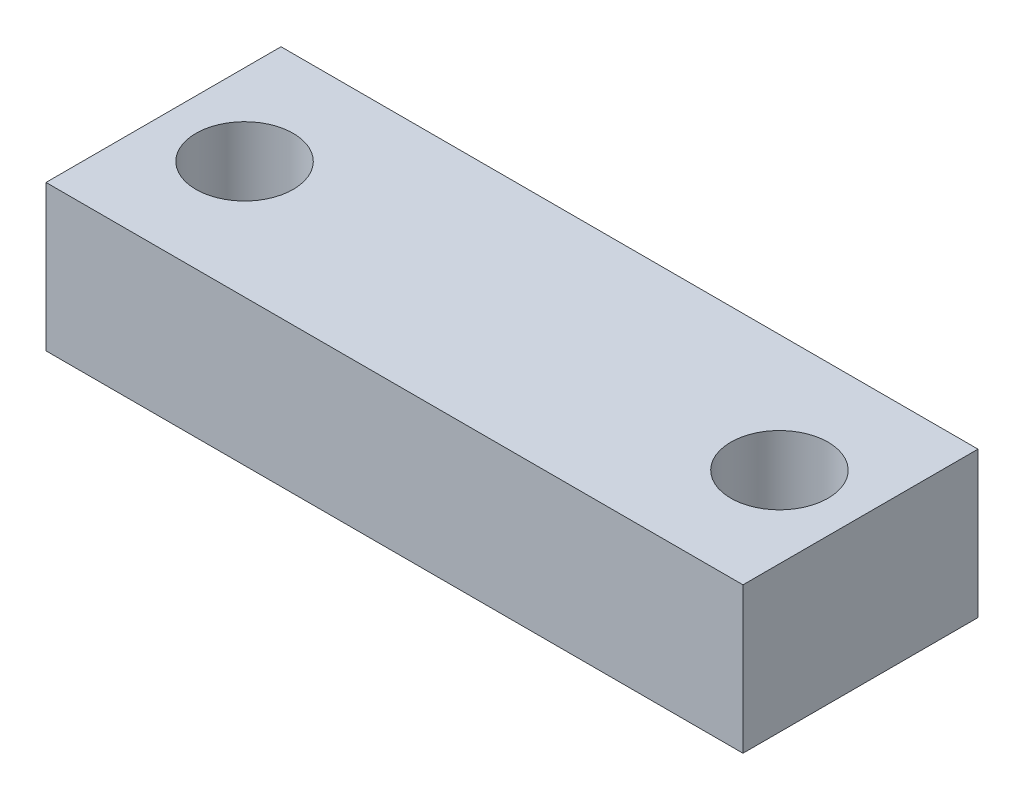
ISO-10303-21;
HEADER;
FILE_DESCRIPTION(('STEP AP214'),'2;1');
FILE_NAME('part.step','',(''),(''),'','','');
FILE_SCHEMA(('AUTOMOTIVE_DESIGN { 1 0 10303 214 1 1 1 1 }'));
ENDSEC;
DATA;
#1=APPLICATION_CONTEXT('core data for automotive mechanical design processes');
#2=APPLICATION_PROTOCOL_DEFINITION('international standard','automotive_design',2000,#1);
#3=PRODUCT_CONTEXT('',#1,'mechanical');
#4=PRODUCT('Part','Part','',(#3));
#5=PRODUCT_RELATED_PRODUCT_CATEGORY('part','',(#4));
#6=PRODUCT_DEFINITION_FORMATION('','',#4);
#7=PRODUCT_DEFINITION_CONTEXT('part definition',#1,'design');
#8=PRODUCT_DEFINITION('design','',#6,#7);
#9=PRODUCT_DEFINITION_SHAPE('','',#8);
#10=(LENGTH_UNIT() NAMED_UNIT(*) SI_UNIT(.MILLI.,.METRE.));
#11=(NAMED_UNIT(*) PLANE_ANGLE_UNIT() SI_UNIT($,.RADIAN.));
#12=(NAMED_UNIT(*) SI_UNIT($,.STERADIAN.) SOLID_ANGLE_UNIT());
#13=UNCERTAINTY_MEASURE_WITH_UNIT(LENGTH_MEASURE(1.E-05),#10,'distance_accuracy_value','');
#14=(GEOMETRIC_REPRESENTATION_CONTEXT(3) GLOBAL_UNCERTAINTY_ASSIGNED_CONTEXT((#13)) GLOBAL_UNIT_ASSIGNED_CONTEXT((#10,
#11,#12)) REPRESENTATION_CONTEXT('',''));
#15=CARTESIAN_POINT('',(0.,0.,0.));
#16=DIRECTION('',(0.,0.,1.));
#17=DIRECTION('',(1.,0.,0.));
#18=AXIS2_PLACEMENT_3D('',#15,#16,#17);
#19=CARTESIAN_POINT('',(21.5,9.,-7.25));
#20=DIRECTION('',(-1.,0.,0.));
#21=DIRECTION('',(0.,0.,1.));
#22=AXIS2_PLACEMENT_3D('',#19,#20,#21);
#23=PLANE('',#22);
#24=DIRECTION('',(0.,0.,-1.));
#25=VECTOR('',#24,1.);
#26=CARTESIAN_POINT('',(21.5,0.,-7.25));
#27=LINE('',#26,#25);
#28=CARTESIAN_POINT('',(21.5,0.,7.25));
#29=VERTEX_POINT('',#28);
#30=CARTESIAN_POINT('',(21.5,0.,-7.25));
#31=VERTEX_POINT('',#30);
#32=EDGE_CURVE('E107',#29,#31,#27,.T.);
#33=ORIENTED_EDGE('',*,*,#32,.T.);
#34=DIRECTION('',(0.,-1.,0.));
#35=VECTOR('',#34,1.);
#36=CARTESIAN_POINT('',(21.5,9.,-7.25));
#37=LINE('',#36,#35);
#38=CARTESIAN_POINT('',(21.5,9.,-7.25));
#39=VERTEX_POINT('',#38);
#40=EDGE_CURVE('E11',#39,#31,#37,.T.);
#41=ORIENTED_EDGE('',*,*,#40,.F.);
#42=DIRECTION('',(0.,0.,-1.));
#43=VECTOR('',#42,1.);
#44=CARTESIAN_POINT('',(21.5,9.,-7.25));
#45=LINE('',#44,#43);
#46=CARTESIAN_POINT('',(21.5,9.,7.25));
#47=VERTEX_POINT('',#46);
#48=EDGE_CURVE('E91',#47,#39,#45,.T.);
#49=ORIENTED_EDGE('',*,*,#48,.F.);
#50=DIRECTION('',(0.,-1.,0.));
#51=VECTOR('',#50,1.);
#52=CARTESIAN_POINT('',(21.5,9.,7.25));
#53=LINE('',#52,#51);
#54=EDGE_CURVE('E103',#47,#29,#53,.T.);
#55=ORIENTED_EDGE('',*,*,#54,.T.);
#56=EDGE_LOOP('',(#33,#41,#49,#55));
#57=FACE_BOUND('',#56,.T.);
#58=ADVANCED_FACE('F39',(#57),#23,.F.);
#59=CARTESIAN_POINT('',(-21.5,9.,-7.25));
#60=DIRECTION('',(0.,0.,1.));
#61=DIRECTION('',(1.,0.,0.));
#62=AXIS2_PLACEMENT_3D('',#59,#60,#61);
#63=PLANE('',#62);
#64=DIRECTION('',(-1.,0.,0.));
#65=VECTOR('',#64,1.);
#66=CARTESIAN_POINT('',(-21.5,0.,-7.25));
#67=LINE('',#66,#65);
#68=CARTESIAN_POINT('',(-21.5,0.,-7.25));
#69=VERTEX_POINT('',#68);
#70=EDGE_CURVE('E96',#31,#69,#67,.T.);
#71=ORIENTED_EDGE('',*,*,#70,.T.);
#72=DIRECTION('',(0.,-1.,0.));
#73=VECTOR('',#72,1.);
#74=CARTESIAN_POINT('',(-21.5,9.,-7.25));
#75=LINE('',#74,#73);
#76=CARTESIAN_POINT('',(-21.5,9.,-7.25));
#77=VERTEX_POINT('',#76);
#78=EDGE_CURVE('E48',#77,#69,#75,.T.);
#79=ORIENTED_EDGE('',*,*,#78,.F.);
#80=DIRECTION('',(-1.,0.,0.));
#81=VECTOR('',#80,1.);
#82=CARTESIAN_POINT('',(-21.5,9.,-7.25));
#83=LINE('',#82,#81);
#84=EDGE_CURVE('E86',#39,#77,#83,.T.);
#85=ORIENTED_EDGE('',*,*,#84,.F.);
#86=ORIENTED_EDGE('',*,*,#40,.T.);
#87=EDGE_LOOP('',(#71,#79,#85,#86));
#88=FACE_BOUND('',#87,.T.);
#89=ADVANCED_FACE('F95',(#88),#63,.F.);
#90=CARTESIAN_POINT('',(-21.5,9.,-7.25));
#91=DIRECTION('',(1.,0.,0.));
#92=DIRECTION('',(0.,0.,-1.));
#93=AXIS2_PLACEMENT_3D('',#90,#91,#92);
#94=PLANE('',#93);
#95=DIRECTION('',(0.,0.,1.));
#96=VECTOR('',#95,1.);
#97=CARTESIAN_POINT('',(-21.5,0.,-7.25));
#98=LINE('',#97,#96);
#99=CARTESIAN_POINT('',(-21.5,0.,7.25));
#100=VERTEX_POINT('',#99);
#101=EDGE_CURVE('E73',#69,#100,#98,.T.);
#102=ORIENTED_EDGE('',*,*,#101,.T.);
#103=DIRECTION('',(0.,-1.,0.));
#104=VECTOR('',#103,1.);
#105=CARTESIAN_POINT('',(-21.5,9.,7.25));
#106=LINE('',#105,#104);
#107=CARTESIAN_POINT('',(-21.5,9.,7.25));
#108=VERTEX_POINT('',#107);
#109=EDGE_CURVE('E98',#108,#100,#106,.T.);
#110=ORIENTED_EDGE('',*,*,#109,.F.);
#111=DIRECTION('',(0.,0.,1.));
#112=VECTOR('',#111,1.);
#113=CARTESIAN_POINT('',(-21.5,9.,-7.25));
#114=LINE('',#113,#112);
#115=EDGE_CURVE('E89',#77,#108,#114,.T.);
#116=ORIENTED_EDGE('',*,*,#115,.F.);
#117=ORIENTED_EDGE('',*,*,#78,.T.);
#118=EDGE_LOOP('',(#102,#110,#116,#117));
#119=FACE_BOUND('',#118,.T.);
#120=ADVANCED_FACE('F99',(#119),#94,.F.);
#121=CARTESIAN_POINT('',(-21.5,9.,7.25));
#122=DIRECTION('',(0.,0.,-1.));
#123=DIRECTION('',(-1.,0.,0.));
#124=AXIS2_PLACEMENT_3D('',#121,#122,#123);
#125=PLANE('',#124);
#126=DIRECTION('',(1.,0.,0.));
#127=VECTOR('',#126,1.);
#128=CARTESIAN_POINT('',(-21.5,0.,7.25));
#129=LINE('',#128,#127);
#130=EDGE_CURVE('E79',#100,#29,#129,.T.);
#131=ORIENTED_EDGE('',*,*,#130,.T.);
#132=ORIENTED_EDGE('',*,*,#54,.F.);
#133=DIRECTION('',(1.,0.,0.));
#134=VECTOR('',#133,1.);
#135=CARTESIAN_POINT('',(-21.5,9.,7.25));
#136=LINE('',#135,#134);
#137=EDGE_CURVE('E56',#108,#47,#136,.T.);
#138=ORIENTED_EDGE('',*,*,#137,.F.);
#139=ORIENTED_EDGE('',*,*,#109,.T.);
#140=EDGE_LOOP('',(#131,#132,#138,#139));
#141=FACE_BOUND('',#140,.T.);
#142=ADVANCED_FACE('F121',(#141),#125,.F.);
#143=CARTESIAN_POINT('',(0.,9.,0.));
#144=DIRECTION('',(0.,1.,0.));
#145=DIRECTION('',(0.,0.,1.));
#146=AXIS2_PLACEMENT_3D('',#143,#144,#145);
#147=PLANE('',#146);
#148=CARTESIAN_POINT('',(-16.5,9.,0.));
#149=DIRECTION('',(0.,1.,0.));
#150=DIRECTION('',(0.,0.,1.));
#151=AXIS2_PLACEMENT_3D('',#148,#149,#150);
#152=CIRCLE('',#151,3.);
#153=CARTESIAN_POINT('',(-16.5,9.,3.));
#154=VERTEX_POINT('',#153);
#155=EDGE_CURVE('E136',#154,#154,#152,.T.);
#156=ORIENTED_EDGE('',*,*,#155,.F.);
#157=EDGE_LOOP('',(#156));
#158=FACE_BOUND('',#157,.T.);
#159=CARTESIAN_POINT('',(16.5,9.,0.));
#160=DIRECTION('',(0.,1.,0.));
#161=DIRECTION('',(0.,0.,-1.));
#162=AXIS2_PLACEMENT_3D('',#159,#160,#161);
#163=CIRCLE('',#162,3.);
#164=CARTESIAN_POINT('',(16.5,9.,-3.));
#165=VERTEX_POINT('',#164);
#166=EDGE_CURVE('E128',#165,#165,#163,.T.);
#167=ORIENTED_EDGE('',*,*,#166,.F.);
#168=EDGE_LOOP('',(#167));
#169=FACE_BOUND('',#168,.T.);
#170=ORIENTED_EDGE('',*,*,#48,.T.);
#171=ORIENTED_EDGE('',*,*,#84,.T.);
#172=ORIENTED_EDGE('',*,*,#115,.T.);
#173=ORIENTED_EDGE('',*,*,#137,.T.);
#174=EDGE_LOOP('',(#170,#171,#172,#173));
#175=FACE_BOUND('',#174,.T.);
#176=ADVANCED_FACE('F87',(#158,#169,#175),#147,.T.);
#177=CARTESIAN_POINT('',(0.,0.,0.));
#178=DIRECTION('',(0.,1.,0.));
#179=DIRECTION('',(0.,0.,1.));
#180=AXIS2_PLACEMENT_3D('',#177,#178,#179);
#181=PLANE('',#180);
#182=CARTESIAN_POINT('',(-16.5,0.,0.));
#183=DIRECTION('',(0.,1.,0.));
#184=DIRECTION('',(0.,0.,1.));
#185=AXIS2_PLACEMENT_3D('',#182,#183,#184);
#186=CIRCLE('',#185,3.);
#187=CARTESIAN_POINT('',(-16.5,0.,3.));
#188=VERTEX_POINT('',#187);
#189=EDGE_CURVE('E111',#188,#188,#186,.T.);
#190=ORIENTED_EDGE('',*,*,#189,.T.);
#191=EDGE_LOOP('',(#190));
#192=FACE_BOUND('',#191,.T.);
#193=CARTESIAN_POINT('',(16.5,0.,0.));
#194=DIRECTION('',(0.,1.,0.));
#195=DIRECTION('',(0.,0.,-1.));
#196=AXIS2_PLACEMENT_3D('',#193,#194,#195);
#197=CIRCLE('',#196,3.);
#198=CARTESIAN_POINT('',(16.5,0.,-3.));
#199=VERTEX_POINT('',#198);
#200=EDGE_CURVE('E132',#199,#199,#197,.T.);
#201=ORIENTED_EDGE('',*,*,#200,.T.);
#202=EDGE_LOOP('',(#201));
#203=FACE_BOUND('',#202,.T.);
#204=ORIENTED_EDGE('',*,*,#32,.F.);
#205=ORIENTED_EDGE('',*,*,#130,.F.);
#206=ORIENTED_EDGE('',*,*,#101,.F.);
#207=ORIENTED_EDGE('',*,*,#70,.F.);
#208=EDGE_LOOP('',(#204,#205,#206,#207));
#209=FACE_BOUND('',#208,.T.);
#210=ADVANCED_FACE('F124',(#192,#203,#209),#181,.F.);
#211=CARTESIAN_POINT('',(16.5,0.,0.));
#212=DIRECTION('',(0.,1.,0.));
#213=DIRECTION('',(0.,0.,1.));
#214=AXIS2_PLACEMENT_3D('',#211,#212,#213);
#215=CYLINDRICAL_SURFACE('',#214,3.);
#216=ORIENTED_EDGE('',*,*,#200,.F.);
#217=EDGE_LOOP('',(#216));
#218=FACE_BOUND('',#217,.T.);
#219=ORIENTED_EDGE('',*,*,#166,.T.);
#220=EDGE_LOOP('',(#219));
#221=FACE_BOUND('',#220,.T.);
#222=ADVANCED_FACE('F149',(#218,#221),#215,.F.);
#223=CARTESIAN_POINT('',(-16.5,0.,0.));
#224=DIRECTION('',(0.,1.,0.));
#225=DIRECTION('',(0.,0.,1.));
#226=AXIS2_PLACEMENT_3D('',#223,#224,#225);
#227=CYLINDRICAL_SURFACE('',#226,3.);
#228=ORIENTED_EDGE('',*,*,#189,.F.);
#229=EDGE_LOOP('',(#228));
#230=FACE_BOUND('',#229,.T.);
#231=ORIENTED_EDGE('',*,*,#155,.T.);
#232=EDGE_LOOP('',(#231));
#233=FACE_BOUND('',#232,.T.);
#234=ADVANCED_FACE('F146',(#230,#233),#227,.F.);
#235=CLOSED_SHELL('',(#58,#89,#120,#142,#176,#210,#222,#234));
#236=MANIFOLD_SOLID_BREP('B2',#235);
#237=ADVANCED_BREP_SHAPE_REPRESENTATION('',(#18,#236),#14);
#238=SHAPE_DEFINITION_REPRESENTATION(#9,#237);
ENDSEC;
END-ISO-10303-21;
